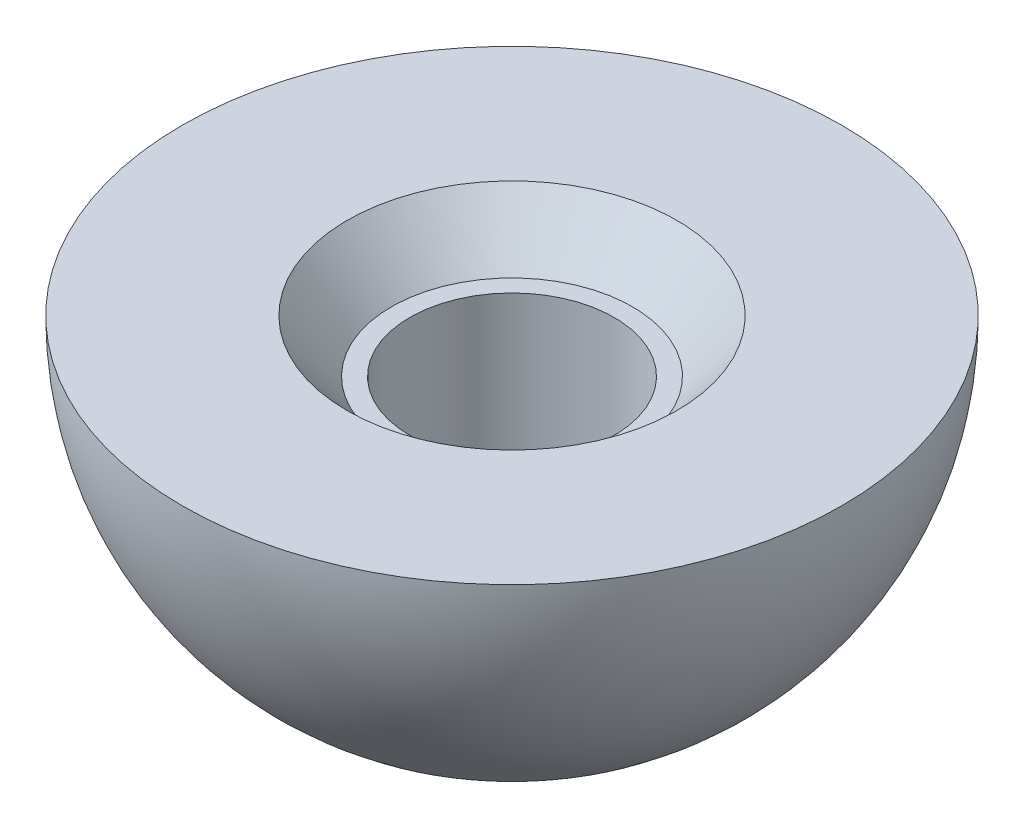
ISO-10303-21;
HEADER;
FILE_DESCRIPTION(('STEP AP214'),'2;1');
FILE_NAME('part.step','',(''),(''),'','','');
FILE_SCHEMA(('AUTOMOTIVE_DESIGN { 1 0 10303 214 1 1 1 1 }'));
ENDSEC;
DATA;
#1=APPLICATION_CONTEXT('core data for automotive mechanical design processes');
#2=APPLICATION_PROTOCOL_DEFINITION('international standard','automotive_design',2000,#1);
#3=PRODUCT_CONTEXT('',#1,'mechanical');
#4=PRODUCT('Part','Part','',(#3));
#5=PRODUCT_RELATED_PRODUCT_CATEGORY('part','',(#4));
#6=PRODUCT_DEFINITION_FORMATION('','',#4);
#7=PRODUCT_DEFINITION_CONTEXT('part definition',#1,'design');
#8=PRODUCT_DEFINITION('design','',#6,#7);
#9=PRODUCT_DEFINITION_SHAPE('','',#8);
#10=(LENGTH_UNIT() NAMED_UNIT(*) SI_UNIT(.MILLI.,.METRE.));
#11=(NAMED_UNIT(*) PLANE_ANGLE_UNIT() SI_UNIT($,.RADIAN.));
#12=(NAMED_UNIT(*) SI_UNIT($,.STERADIAN.) SOLID_ANGLE_UNIT());
#13=UNCERTAINTY_MEASURE_WITH_UNIT(LENGTH_MEASURE(1.E-05),#10,'distance_accuracy_value','');
#14=(GEOMETRIC_REPRESENTATION_CONTEXT(3) GLOBAL_UNCERTAINTY_ASSIGNED_CONTEXT((#13)) GLOBAL_UNIT_ASSIGNED_CONTEXT((#10,
#11,#12)) REPRESENTATION_CONTEXT('',''));
#15=CARTESIAN_POINT('',(0.,0.,0.));
#16=DIRECTION('',(0.,0.,1.));
#17=DIRECTION('',(1.,0.,0.));
#18=AXIS2_PLACEMENT_3D('',#15,#16,#17);
#19=CARTESIAN_POINT('',(0.,-5.00000000000003,0.));
#20=DIRECTION('',(0.,1.,0.));
#21=DIRECTION('',(0.,0.,1.));
#22=AXIS2_PLACEMENT_3D('',#19,#20,#21);
#23=CYLINDRICAL_SURFACE('',#22,1.55);
#24=CARTESIAN_POINT('',(0.,-4.75368278285373,0.));
#25=DIRECTION('',(0.,1.,0.));
#26=DIRECTION('',(0.,0.,1.));
#27=AXIS2_PLACEMENT_3D('',#24,#25,#26);
#28=CIRCLE('',#27,1.55);
#29=CARTESIAN_POINT('',(0.,-4.75368278285372,1.55000000000003));
#30=VERTEX_POINT('',#29);
#31=EDGE_CURVE('E39',#30,#30,#28,.F.);
#32=ORIENTED_EDGE('',*,*,#31,.T.);
#33=EDGE_LOOP('',(#32));
#34=FACE_BOUND('',#33,.T.);
#35=CARTESIAN_POINT('',(0.,-0.8,0.));
#36=DIRECTION('',(0.,1.,0.));
#37=DIRECTION('',(0.,0.,1.));
#38=AXIS2_PLACEMENT_3D('',#35,#36,#37);
#39=CIRCLE('',#38,1.55);
#40=CARTESIAN_POINT('',(0.,-0.799999999999989,1.55000000000001));
#41=VERTEX_POINT('',#40);
#42=EDGE_CURVE('E35',#41,#41,#39,.F.);
#43=ORIENTED_EDGE('',*,*,#42,.F.);
#44=EDGE_LOOP('',(#43));
#45=FACE_BOUND('',#44,.T.);
#46=ADVANCED_FACE('F31',(#34,#45),#23,.F.);
#47=CARTESIAN_POINT('',(0.,0.,0.));
#48=DIRECTION('',(1.,0.,0.));
#49=DIRECTION('',(0.,0.,-1.));
#50=AXIS2_PLACEMENT_3D('',#47,#48,#49);
#51=SPHERICAL_SURFACE('',#50,5.);
#52=CARTESIAN_POINT('',(0.,0.,0.));
#53=DIRECTION('',(0.,1.,0.));
#54=DIRECTION('',(0.,0.,1.));
#55=AXIS2_PLACEMENT_3D('',#52,#53,#54);
#56=SPHERICAL_SURFACE('',#55,5.);
#57=ORIENTED_EDGE('',*,*,#31,.F.);
#58=EDGE_LOOP('',(#57));
#59=FACE_BOUND('',#58,.T.);
#60=CARTESIAN_POINT('',(0.,0.,0.));
#61=DIRECTION('',(0.,-1.,0.));
#62=DIRECTION('',(0.,0.,-1.));
#63=AXIS2_PLACEMENT_3D('',#60,#61,#62);
#64=CIRCLE('',#63,5.);
#65=CARTESIAN_POINT('',(0.,0.,-5.));
#66=VERTEX_POINT('',#65);
#67=EDGE_CURVE('E10',#66,#66,#64,.T.);
#68=ORIENTED_EDGE('',*,*,#67,.T.);
#69=EDGE_LOOP('',(#68));
#70=FACE_BOUND('',#69,.T.);
#71=ADVANCED_FACE('F33',(#59,#70),#56,.T.);
#72=CARTESIAN_POINT('',(0.,0.,0.));
#73=DIRECTION('',(0.,-1.,0.));
#74=DIRECTION('',(0.,0.,-1.));
#75=AXIS2_PLACEMENT_3D('',#72,#73,#74);
#76=PLANE('',#75);
#77=CARTESIAN_POINT('',(0.,0.,0.));
#78=DIRECTION('',(0.,1.,0.));
#79=DIRECTION('',(0.,0.,1.));
#80=AXIS2_PLACEMENT_3D('',#77,#78,#79);
#81=CIRCLE('',#80,2.5);
#82=CARTESIAN_POINT('',(0.,0.,2.5));
#83=VERTEX_POINT('',#82);
#84=EDGE_CURVE('E48',#83,#83,#81,.T.);
#85=ORIENTED_EDGE('',*,*,#84,.F.);
#86=EDGE_LOOP('',(#85));
#87=FACE_BOUND('',#86,.T.);
#88=ORIENTED_EDGE('',*,*,#67,.F.);
#89=EDGE_LOOP('',(#88));
#90=FACE_BOUND('',#89,.T.);
#91=ADVANCED_FACE('F54',(#87,#90),#76,.F.);
#92=CARTESIAN_POINT('',(0.,-0.8,0.));
#93=DIRECTION('',(0.,1.,0.));
#94=DIRECTION('',(0.,0.,1.));
#95=AXIS2_PLACEMENT_3D('',#92,#93,#94);
#96=PLANE('',#95);
#97=CARTESIAN_POINT('',(0.,-0.8,0.));
#98=DIRECTION('',(0.,1.,0.));
#99=DIRECTION('',(0.,0.,1.));
#100=AXIS2_PLACEMENT_3D('',#97,#98,#99);
#101=CIRCLE('',#100,1.82872029505817);
#102=CARTESIAN_POINT('',(0.,-0.799999999999987,1.82872029505818));
#103=VERTEX_POINT('',#102);
#104=EDGE_CURVE('E45',#103,#103,#101,.T.);
#105=ORIENTED_EDGE('',*,*,#104,.T.);
#106=EDGE_LOOP('',(#105));
#107=FACE_BOUND('',#106,.T.);
#108=ORIENTED_EDGE('',*,*,#42,.T.);
#109=EDGE_LOOP('',(#108));
#110=FACE_BOUND('',#109,.T.);
#111=ADVANCED_FACE('F57',(#107,#110),#96,.T.);
#112=CARTESIAN_POINT('',(0.,0.,0.));
#113=DIRECTION('',(0.,1.,0.));
#114=DIRECTION('',(0.,0.,1.));
#115=AXIS2_PLACEMENT_3D('',#112,#113,#114);
#116=CONICAL_SURFACE('',#115,2.5,0.698131700797733);
#117=ORIENTED_EDGE('',*,*,#104,.F.);
#118=EDGE_LOOP('',(#117));
#119=FACE_BOUND('',#118,.T.);
#120=ORIENTED_EDGE('',*,*,#84,.T.);
#121=EDGE_LOOP('',(#120));
#122=FACE_BOUND('',#121,.T.);
#123=ADVANCED_FACE('F52',(#119,#122),#116,.F.);
#124=CLOSED_SHELL('',(#46,#71,#91,#111,#123));
#125=MANIFOLD_SOLID_BREP('B2',#124);
#126=ADVANCED_BREP_SHAPE_REPRESENTATION('',(#18,#125),#14);
#127=SHAPE_DEFINITION_REPRESENTATION(#9,#126);
ENDSEC;
END-ISO-10303-21;
